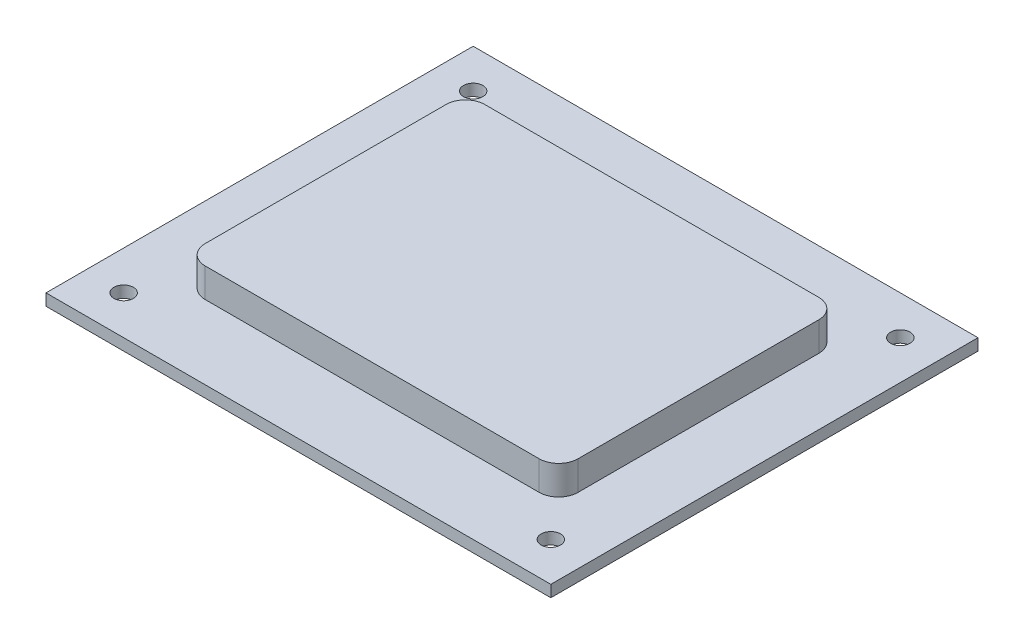
ISO-10303-21;
HEADER;
FILE_DESCRIPTION(('STEP AP214'),'2;1');
FILE_NAME('part.step','',(''),(''),'','','');
FILE_SCHEMA(('AUTOMOTIVE_DESIGN { 1 0 10303 214 1 1 1 1 }'));
ENDSEC;
DATA;
#1=APPLICATION_CONTEXT('core data for automotive mechanical design processes');
#2=APPLICATION_PROTOCOL_DEFINITION('international standard','automotive_design',2000,#1);
#3=PRODUCT_CONTEXT('',#1,'mechanical');
#4=PRODUCT('Part','Part','',(#3));
#5=PRODUCT_RELATED_PRODUCT_CATEGORY('part','',(#4));
#6=PRODUCT_DEFINITION_FORMATION('','',#4);
#7=PRODUCT_DEFINITION_CONTEXT('part definition',#1,'design');
#8=PRODUCT_DEFINITION('design','',#6,#7);
#9=PRODUCT_DEFINITION_SHAPE('','',#8);
#10=(LENGTH_UNIT() NAMED_UNIT(*) SI_UNIT(.MILLI.,.METRE.));
#11=(NAMED_UNIT(*) PLANE_ANGLE_UNIT() SI_UNIT($,.RADIAN.));
#12=(NAMED_UNIT(*) SI_UNIT($,.STERADIAN.) SOLID_ANGLE_UNIT());
#13=UNCERTAINTY_MEASURE_WITH_UNIT(LENGTH_MEASURE(1.E-05),#10,'distance_accuracy_value','');
#14=(GEOMETRIC_REPRESENTATION_CONTEXT(3) GLOBAL_UNCERTAINTY_ASSIGNED_CONTEXT((#13)) GLOBAL_UNIT_ASSIGNED_CONTEXT((#10,
#11,#12)) REPRESENTATION_CONTEXT('',''));
#15=CARTESIAN_POINT('',(0.,0.,0.));
#16=DIRECTION('',(0.,0.,1.));
#17=DIRECTION('',(1.,0.,0.));
#18=AXIS2_PLACEMENT_3D('',#15,#16,#17);
#19=CARTESIAN_POINT('',(8.32688679245284,4.7625,-18.6066981132075));
#20=DIRECTION('',(0.,-1.,0.));
#21=DIRECTION('',(0.,0.,-1.));
#22=AXIS2_PLACEMENT_3D('',#19,#20,#21);
#23=CYLINDRICAL_SURFACE('',#22,3.175);
#24=CARTESIAN_POINT('',(8.32688679245284,0.,-18.6066981132075));
#25=DIRECTION('',(0.,1.,0.));
#26=DIRECTION('',(0.,0.,-1.));
#27=AXIS2_PLACEMENT_3D('',#24,#25,#26);
#28=CIRCLE('',#27,3.175);
#29=CARTESIAN_POINT('',(11.5018867924528,0.,-18.6066981132075));
#30=VERTEX_POINT('',#29);
#31=CARTESIAN_POINT('',(8.32688679245284,0.,-21.7816981132075));
#32=VERTEX_POINT('',#31);
#33=EDGE_CURVE('E155',#30,#32,#28,.T.);
#34=ORIENTED_EDGE('',*,*,#33,.T.);
#35=DIRECTION('',(0.,-1.,0.));
#36=VECTOR('',#35,1.);
#37=CARTESIAN_POINT('',(8.32688679245284,4.7625,-21.7816981132075));
#38=LINE('',#37,#36);
#39=CARTESIAN_POINT('',(8.32688679245284,4.7625,-21.7816981132075));
#40=VERTEX_POINT('',#39);
#41=EDGE_CURVE('E11',#40,#32,#38,.T.);
#42=ORIENTED_EDGE('',*,*,#41,.F.);
#43=CARTESIAN_POINT('',(8.32688679245284,4.7625,-18.6066981132075));
#44=DIRECTION('',(0.,1.,0.));
#45=DIRECTION('',(0.,0.,-1.));
#46=AXIS2_PLACEMENT_3D('',#43,#44,#45);
#47=CIRCLE('',#46,3.175);
#48=CARTESIAN_POINT('',(11.5018867924528,4.7625,-18.6066981132075));
#49=VERTEX_POINT('',#48);
#50=EDGE_CURVE('E166',#49,#40,#47,.T.);
#51=ORIENTED_EDGE('',*,*,#50,.F.);
#52=DIRECTION('',(0.,-1.,0.));
#53=VECTOR('',#52,1.);
#54=CARTESIAN_POINT('',(11.5018867924528,4.7625,-18.6066981132075));
#55=LINE('',#54,#53);
#56=EDGE_CURVE('E189',#49,#30,#55,.T.);
#57=ORIENTED_EDGE('',*,*,#56,.T.);
#58=EDGE_LOOP('',(#34,#42,#51,#57));
#59=FACE_BOUND('',#58,.T.);
#60=ADVANCED_FACE('F42',(#59),#23,.T.);
#61=CARTESIAN_POINT('',(-46.2831132075471,4.7625,-21.7816981132075));
#62=DIRECTION('',(0.,0.,1.));
#63=DIRECTION('',(1.,0.,0.));
#64=AXIS2_PLACEMENT_3D('',#61,#62,#63);
#65=PLANE('',#64);
#66=DIRECTION('',(-1.,0.,0.));
#67=VECTOR('',#66,1.);
#68=CARTESIAN_POINT('',(-46.2831132075471,0.,-21.7816981132075));
#69=LINE('',#68,#67);
#70=CARTESIAN_POINT('',(-46.2831132075471,0.,-21.7816981132075));
#71=VERTEX_POINT('',#70);
#72=EDGE_CURVE('E160',#32,#71,#69,.T.);
#73=ORIENTED_EDGE('',*,*,#72,.T.);
#74=DIRECTION('',(0.,-1.,0.));
#75=VECTOR('',#74,1.);
#76=CARTESIAN_POINT('',(-46.2831132075471,4.7625,-21.7816981132075));
#77=LINE('',#76,#75);
#78=CARTESIAN_POINT('',(-46.2831132075471,4.7625,-21.7816981132075));
#79=VERTEX_POINT('',#78);
#80=EDGE_CURVE('E51',#79,#71,#77,.T.);
#81=ORIENTED_EDGE('',*,*,#80,.F.);
#82=DIRECTION('',(-1.,0.,0.));
#83=VECTOR('',#82,1.);
#84=CARTESIAN_POINT('',(-46.2831132075471,4.7625,-21.7816981132075));
#85=LINE('',#84,#83);
#86=EDGE_CURVE('E169',#40,#79,#85,.T.);
#87=ORIENTED_EDGE('',*,*,#86,.F.);
#88=ORIENTED_EDGE('',*,*,#41,.T.);
#89=EDGE_LOOP('',(#73,#81,#87,#88));
#90=FACE_BOUND('',#89,.T.);
#91=ADVANCED_FACE('F248',(#90),#65,.F.);
#92=CARTESIAN_POINT('',(-46.2831132075472,4.7625,-18.6066981132075));
#93=DIRECTION('',(0.,-1.,0.));
#94=DIRECTION('',(0.,0.,-1.));
#95=AXIS2_PLACEMENT_3D('',#92,#93,#94);
#96=CYLINDRICAL_SURFACE('',#95,3.175);
#97=CARTESIAN_POINT('',(-46.2831132075472,0.,-18.6066981132075));
#98=DIRECTION('',(0.,1.,0.));
#99=DIRECTION('',(0.,0.,1.));
#100=AXIS2_PLACEMENT_3D('',#97,#98,#99);
#101=CIRCLE('',#100,3.175);
#102=CARTESIAN_POINT('',(-49.4581132075472,0.,-18.6066981132075));
#103=VERTEX_POINT('',#102);
#104=EDGE_CURVE('E194',#71,#103,#101,.T.);
#105=ORIENTED_EDGE('',*,*,#104,.T.);
#106=DIRECTION('',(0.,-1.,0.));
#107=VECTOR('',#106,1.);
#108=CARTESIAN_POINT('',(-49.4581132075472,4.7625,-18.6066981132075));
#109=LINE('',#108,#107);
#110=CARTESIAN_POINT('',(-49.4581132075472,4.7625,-18.6066981132075));
#111=VERTEX_POINT('',#110);
#112=EDGE_CURVE('E236',#111,#103,#109,.T.);
#113=ORIENTED_EDGE('',*,*,#112,.F.);
#114=CARTESIAN_POINT('',(-46.2831132075472,4.7625,-18.6066981132075));
#115=DIRECTION('',(0.,1.,0.));
#116=DIRECTION('',(0.,0.,1.));
#117=AXIS2_PLACEMENT_3D('',#114,#115,#116);
#118=CIRCLE('',#117,3.175);
#119=EDGE_CURVE('E173',#79,#111,#118,.T.);
#120=ORIENTED_EDGE('',*,*,#119,.F.);
#121=ORIENTED_EDGE('',*,*,#80,.T.);
#122=EDGE_LOOP('',(#105,#113,#120,#121));
#123=FACE_BOUND('',#122,.T.);
#124=ADVANCED_FACE('F244',(#123),#96,.T.);
#125=CARTESIAN_POINT('',(-49.4581132075472,4.7625,-18.6066981132075));
#126=DIRECTION('',(1.,0.,0.));
#127=DIRECTION('',(0.,0.,-1.));
#128=AXIS2_PLACEMENT_3D('',#125,#126,#127);
#129=PLANE('',#128);
#130=DIRECTION('',(0.,0.,1.));
#131=VECTOR('',#130,1.);
#132=CARTESIAN_POINT('',(-49.4581132075472,0.,-18.6066981132075));
#133=LINE('',#132,#131);
#134=CARTESIAN_POINT('',(-49.4581132075472,0.,20.7633018867924));
#135=VERTEX_POINT('',#134);
#136=EDGE_CURVE('E198',#103,#135,#133,.T.);
#137=ORIENTED_EDGE('',*,*,#136,.T.);
#138=DIRECTION('',(0.,-1.,0.));
#139=VECTOR('',#138,1.);
#140=CARTESIAN_POINT('',(-49.4581132075472,4.7625,20.7633018867924));
#141=LINE('',#140,#139);
#142=CARTESIAN_POINT('',(-49.4581132075472,4.7625,20.7633018867924));
#143=VERTEX_POINT('',#142);
#144=EDGE_CURVE('E232',#143,#135,#141,.T.);
#145=ORIENTED_EDGE('',*,*,#144,.F.);
#146=DIRECTION('',(0.,0.,1.));
#147=VECTOR('',#146,1.);
#148=CARTESIAN_POINT('',(-49.4581132075472,4.7625,-18.6066981132075));
#149=LINE('',#148,#147);
#150=EDGE_CURVE('E176',#111,#143,#149,.T.);
#151=ORIENTED_EDGE('',*,*,#150,.F.);
#152=ORIENTED_EDGE('',*,*,#112,.T.);
#153=EDGE_LOOP('',(#137,#145,#151,#152));
#154=FACE_BOUND('',#153,.T.);
#155=ADVANCED_FACE('F255',(#154),#129,.F.);
#156=CARTESIAN_POINT('',(-46.2831132075472,4.7625,20.7633018867925));
#157=DIRECTION('',(0.,-1.,0.));
#158=DIRECTION('',(0.,0.,-1.));
#159=AXIS2_PLACEMENT_3D('',#156,#157,#158);
#160=CYLINDRICAL_SURFACE('',#159,3.175);
#161=CARTESIAN_POINT('',(-46.2831132075472,0.,20.7633018867925));
#162=DIRECTION('',(0.,1.,0.));
#163=DIRECTION('',(0.,0.,1.));
#164=AXIS2_PLACEMENT_3D('',#161,#162,#163);
#165=CIRCLE('',#164,3.175);
#166=CARTESIAN_POINT('',(-46.2831132075472,0.,23.9383018867925));
#167=VERTEX_POINT('',#166);
#168=EDGE_CURVE('E202',#135,#167,#165,.T.);
#169=ORIENTED_EDGE('',*,*,#168,.T.);
#170=DIRECTION('',(0.,-1.,0.));
#171=VECTOR('',#170,1.);
#172=CARTESIAN_POINT('',(-46.2831132075472,4.7625,23.9383018867925));
#173=LINE('',#172,#171);
#174=CARTESIAN_POINT('',(-46.2831132075472,4.7625,23.9383018867925));
#175=VERTEX_POINT('',#174);
#176=EDGE_CURVE('E228',#175,#167,#173,.T.);
#177=ORIENTED_EDGE('',*,*,#176,.F.);
#178=CARTESIAN_POINT('',(-46.2831132075472,4.7625,20.7633018867925));
#179=DIRECTION('',(0.,1.,0.));
#180=DIRECTION('',(0.,0.,1.));
#181=AXIS2_PLACEMENT_3D('',#178,#179,#180);
#182=CIRCLE('',#181,3.175);
#183=EDGE_CURVE('E179',#143,#175,#182,.T.);
#184=ORIENTED_EDGE('',*,*,#183,.F.);
#185=ORIENTED_EDGE('',*,*,#144,.T.);
#186=EDGE_LOOP('',(#169,#177,#184,#185));
#187=FACE_BOUND('',#186,.T.);
#188=ADVANCED_FACE('F259',(#187),#160,.T.);
#189=CARTESIAN_POINT('',(-46.2831132075471,4.7625,23.9383018867925));
#190=DIRECTION('',(0.,0.,-1.));
#191=DIRECTION('',(-1.,0.,0.));
#192=AXIS2_PLACEMENT_3D('',#189,#190,#191);
#193=PLANE('',#192);
#194=DIRECTION('',(1.,0.,0.));
#195=VECTOR('',#194,1.);
#196=CARTESIAN_POINT('',(-46.2831132075471,0.,23.9383018867925));
#197=LINE('',#196,#195);
#198=CARTESIAN_POINT('',(8.32688679245284,0.,23.9383018867925));
#199=VERTEX_POINT('',#198);
#200=EDGE_CURVE('E206',#167,#199,#197,.T.);
#201=ORIENTED_EDGE('',*,*,#200,.T.);
#202=DIRECTION('',(0.,-1.,0.));
#203=VECTOR('',#202,1.);
#204=CARTESIAN_POINT('',(8.32688679245284,4.7625,23.9383018867925));
#205=LINE('',#204,#203);
#206=CARTESIAN_POINT('',(8.32688679245284,4.7625,23.9383018867925));
#207=VERTEX_POINT('',#206);
#208=EDGE_CURVE('E224',#207,#199,#205,.T.);
#209=ORIENTED_EDGE('',*,*,#208,.F.);
#210=DIRECTION('',(1.,0.,0.));
#211=VECTOR('',#210,1.);
#212=CARTESIAN_POINT('',(-46.2831132075471,4.7625,23.9383018867925));
#213=LINE('',#212,#211);
#214=EDGE_CURVE('E182',#175,#207,#213,.T.);
#215=ORIENTED_EDGE('',*,*,#214,.F.);
#216=ORIENTED_EDGE('',*,*,#176,.T.);
#217=EDGE_LOOP('',(#201,#209,#215,#216));
#218=FACE_BOUND('',#217,.T.);
#219=ADVANCED_FACE('F273',(#218),#193,.F.);
#220=CARTESIAN_POINT('',(8.32688679245284,4.7625,20.7633018867925));
#221=DIRECTION('',(0.,-1.,0.));
#222=DIRECTION('',(0.,0.,-1.));
#223=AXIS2_PLACEMENT_3D('',#220,#221,#222);
#224=CYLINDRICAL_SURFACE('',#223,3.175);
#225=CARTESIAN_POINT('',(8.32688679245284,0.,20.7633018867925));
#226=DIRECTION('',(0.,1.,0.));
#227=DIRECTION('',(0.,0.,-1.));
#228=AXIS2_PLACEMENT_3D('',#225,#226,#227);
#229=CIRCLE('',#228,3.175);
#230=CARTESIAN_POINT('',(11.5018867924528,0.,20.7633018867925));
#231=VERTEX_POINT('',#230);
#232=EDGE_CURVE('E210',#199,#231,#229,.T.);
#233=ORIENTED_EDGE('',*,*,#232,.T.);
#234=DIRECTION('',(0.,-1.,0.));
#235=VECTOR('',#234,1.);
#236=CARTESIAN_POINT('',(11.5018867924528,4.7625,20.7633018867925));
#237=LINE('',#236,#235);
#238=CARTESIAN_POINT('',(11.5018867924528,4.7625,20.7633018867925));
#239=VERTEX_POINT('',#238);
#240=EDGE_CURVE('E220',#239,#231,#237,.T.);
#241=ORIENTED_EDGE('',*,*,#240,.F.);
#242=CARTESIAN_POINT('',(8.32688679245284,4.7625,20.7633018867925));
#243=DIRECTION('',(0.,1.,0.));
#244=DIRECTION('',(0.,0.,-1.));
#245=AXIS2_PLACEMENT_3D('',#242,#243,#244);
#246=CIRCLE('',#245,3.175);
#247=EDGE_CURVE('E185',#207,#239,#246,.T.);
#248=ORIENTED_EDGE('',*,*,#247,.F.);
#249=ORIENTED_EDGE('',*,*,#208,.T.);
#250=EDGE_LOOP('',(#233,#241,#248,#249));
#251=FACE_BOUND('',#250,.T.);
#252=ADVANCED_FACE('F270',(#251),#224,.T.);
#253=CARTESIAN_POINT('',(11.5018867924528,4.7625,-18.6066981132075));
#254=DIRECTION('',(-1.,0.,0.));
#255=DIRECTION('',(0.,0.,1.));
#256=AXIS2_PLACEMENT_3D('',#253,#254,#255);
#257=PLANE('',#256);
#258=DIRECTION('',(0.,0.,-1.));
#259=VECTOR('',#258,1.);
#260=CARTESIAN_POINT('',(11.5018867924528,0.,-18.6066981132075));
#261=LINE('',#260,#259);
#262=EDGE_CURVE('E170',#231,#30,#261,.T.);
#263=ORIENTED_EDGE('',*,*,#262,.T.);
#264=ORIENTED_EDGE('',*,*,#56,.F.);
#265=DIRECTION('',(0.,0.,-1.));
#266=VECTOR('',#265,1.);
#267=CARTESIAN_POINT('',(11.5018867924528,4.7625,-18.6066981132075));
#268=LINE('',#267,#266);
#269=EDGE_CURVE('E58',#239,#49,#268,.T.);
#270=ORIENTED_EDGE('',*,*,#269,.F.);
#271=ORIENTED_EDGE('',*,*,#240,.T.);
#272=EDGE_LOOP('',(#263,#264,#270,#271));
#273=FACE_BOUND('',#272,.T.);
#274=ADVANCED_FACE('F267',(#273),#257,.F.);
#275=CARTESIAN_POINT('',(8.32688679245284,4.7625,-18.6066981132075));
#276=DIRECTION('',(0.,-1.,0.));
#277=DIRECTION('',(0.,0.,-1.));
#278=AXIS2_PLACEMENT_3D('',#275,#276,#277);
#279=PLANE('',#278);
#280=ORIENTED_EDGE('',*,*,#50,.T.);
#281=ORIENTED_EDGE('',*,*,#86,.T.);
#282=ORIENTED_EDGE('',*,*,#119,.T.);
#283=ORIENTED_EDGE('',*,*,#150,.T.);
#284=ORIENTED_EDGE('',*,*,#183,.T.);
#285=ORIENTED_EDGE('',*,*,#214,.T.);
#286=ORIENTED_EDGE('',*,*,#247,.T.);
#287=ORIENTED_EDGE('',*,*,#269,.T.);
#288=EDGE_LOOP('',(#280,#281,#282,#283,#284,#285,#286,#287));
#289=FACE_BOUND('',#288,.T.);
#290=ADVANCED_FACE('F262',(#289),#279,.F.);
#291=CARTESIAN_POINT('',(-60.2531132075472,-1.905,36.0033018867925));
#292=DIRECTION('',(1.,0.,0.));
#293=DIRECTION('',(0.,0.,-1.));
#294=AXIS2_PLACEMENT_3D('',#291,#292,#293);
#295=PLANE('',#294);
#296=DIRECTION('',(0.,0.,-1.));
#297=VECTOR('',#296,1.);
#298=CARTESIAN_POINT('',(-60.2531132075472,0.,36.0033018867925));
#299=LINE('',#298,#297);
#300=CARTESIAN_POINT('',(-60.2531132075472,0.,36.0033018867925));
#301=VERTEX_POINT('',#300);
#302=CARTESIAN_POINT('',(-60.2531132075471,0.,-33.8466981132075));
#303=VERTEX_POINT('',#302);
#304=EDGE_CURVE('E153',#301,#303,#299,.T.);
#305=ORIENTED_EDGE('',*,*,#304,.T.);
#306=DIRECTION('',(0.,1.,0.));
#307=VECTOR('',#306,1.);
#308=CARTESIAN_POINT('',(-60.2531132075471,-1.905,-33.8466981132075));
#309=LINE('',#308,#307);
#310=CARTESIAN_POINT('',(-60.2531132075471,-1.905,-33.8466981132075));
#311=VERTEX_POINT('',#310);
#312=EDGE_CURVE('E131',#311,#303,#309,.T.);
#313=ORIENTED_EDGE('',*,*,#312,.F.);
#314=DIRECTION('',(0.,0.,-1.));
#315=VECTOR('',#314,1.);
#316=CARTESIAN_POINT('',(-60.2531132075472,-1.905,36.0033018867925));
#317=LINE('',#316,#315);
#318=CARTESIAN_POINT('',(-60.2531132075472,-1.905,36.0033018867925));
#319=VERTEX_POINT('',#318);
#320=EDGE_CURVE('E139',#319,#311,#317,.T.);
#321=ORIENTED_EDGE('',*,*,#320,.F.);
#322=DIRECTION('',(0.,1.,0.));
#323=VECTOR('',#322,1.);
#324=CARTESIAN_POINT('',(-60.2531132075472,-1.905,36.0033018867925));
#325=LINE('',#324,#323);
#326=EDGE_CURVE('E507',#319,#301,#325,.T.);
#327=ORIENTED_EDGE('',*,*,#326,.T.);
#328=EDGE_LOOP('',(#305,#313,#321,#327));
#329=FACE_BOUND('',#328,.T.);
#330=ADVANCED_FACE('F151',(#329),#295,.F.);
#331=CARTESIAN_POINT('',(-60.2531132075471,-1.905,-33.8466981132075));
#332=DIRECTION('',(0.,0.,1.));
#333=DIRECTION('',(1.,0.,0.));
#334=AXIS2_PLACEMENT_3D('',#331,#332,#333);
#335=PLANE('',#334);
#336=DIRECTION('',(1.,0.,0.));
#337=VECTOR('',#336,1.);
#338=CARTESIAN_POINT('',(-60.2531132075471,0.,-33.8466981132075));
#339=LINE('',#338,#337);
#340=CARTESIAN_POINT('',(22.2968867924529,0.,-33.8466981132075));
#341=VERTEX_POINT('',#340);
#342=EDGE_CURVE('E510',#303,#341,#339,.T.);
#343=ORIENTED_EDGE('',*,*,#342,.T.);
#344=DIRECTION('',(0.,1.,0.));
#345=VECTOR('',#344,1.);
#346=CARTESIAN_POINT('',(22.2968867924529,-1.905,-33.8466981132075));
#347=LINE('',#346,#345);
#348=CARTESIAN_POINT('',(22.2968867924529,-1.905,-33.8466981132075));
#349=VERTEX_POINT('',#348);
#350=EDGE_CURVE('E134',#349,#341,#347,.T.);
#351=ORIENTED_EDGE('',*,*,#350,.F.);
#352=DIRECTION('',(1.,0.,0.));
#353=VECTOR('',#352,1.);
#354=CARTESIAN_POINT('',(-60.2531132075471,-1.905,-33.8466981132075));
#355=LINE('',#354,#353);
#356=EDGE_CURVE('E127',#311,#349,#355,.T.);
#357=ORIENTED_EDGE('',*,*,#356,.F.);
#358=ORIENTED_EDGE('',*,*,#312,.T.);
#359=EDGE_LOOP('',(#343,#351,#357,#358));
#360=FACE_BOUND('',#359,.T.);
#361=ADVANCED_FACE('F129',(#360),#335,.F.);
#362=CARTESIAN_POINT('',(22.2968867924529,-1.905,36.0033018867925));
#363=DIRECTION('',(-1.,0.,0.));
#364=DIRECTION('',(0.,0.,1.));
#365=AXIS2_PLACEMENT_3D('',#362,#363,#364);
#366=PLANE('',#365);
#367=DIRECTION('',(0.,0.,1.));
#368=VECTOR('',#367,1.);
#369=CARTESIAN_POINT('',(22.2968867924529,0.,36.0033018867925));
#370=LINE('',#369,#368);
#371=CARTESIAN_POINT('',(22.2968867924529,0.,36.0033018867925));
#372=VERTEX_POINT('',#371);
#373=EDGE_CURVE('E513',#341,#372,#370,.T.);
#374=ORIENTED_EDGE('',*,*,#373,.T.);
#375=DIRECTION('',(0.,1.,0.));
#376=VECTOR('',#375,1.);
#377=CARTESIAN_POINT('',(22.2968867924529,-1.905,36.0033018867925));
#378=LINE('',#377,#376);
#379=CARTESIAN_POINT('',(22.2968867924529,-1.905,36.0033018867925));
#380=VERTEX_POINT('',#379);
#381=EDGE_CURVE('E162',#380,#372,#378,.T.);
#382=ORIENTED_EDGE('',*,*,#381,.F.);
#383=DIRECTION('',(0.,0.,1.));
#384=VECTOR('',#383,1.);
#385=CARTESIAN_POINT('',(22.2968867924529,-1.905,36.0033018867925));
#386=LINE('',#385,#384);
#387=EDGE_CURVE('E138',#349,#380,#386,.T.);
#388=ORIENTED_EDGE('',*,*,#387,.F.);
#389=ORIENTED_EDGE('',*,*,#350,.T.);
#390=EDGE_LOOP('',(#374,#382,#388,#389));
#391=FACE_BOUND('',#390,.T.);
#392=ADVANCED_FACE('F342',(#391),#366,.F.);
#393=CARTESIAN_POINT('',(-60.2531132075472,-1.905,36.0033018867925));
#394=DIRECTION('',(0.,0.,-1.));
#395=DIRECTION('',(-1.,0.,0.));
#396=AXIS2_PLACEMENT_3D('',#393,#394,#395);
#397=PLANE('',#396);
#398=DIRECTION('',(-1.,0.,0.));
#399=VECTOR('',#398,1.);
#400=CARTESIAN_POINT('',(-60.2531132075472,0.,36.0033018867925));
#401=LINE('',#400,#399);
#402=EDGE_CURVE('E149',#372,#301,#401,.T.);
#403=ORIENTED_EDGE('',*,*,#402,.T.);
#404=ORIENTED_EDGE('',*,*,#326,.F.);
#405=DIRECTION('',(-1.,0.,0.));
#406=VECTOR('',#405,1.);
#407=CARTESIAN_POINT('',(-60.2531132075472,-1.905,36.0033018867925));
#408=LINE('',#407,#406);
#409=EDGE_CURVE('E144',#380,#319,#408,.T.);
#410=ORIENTED_EDGE('',*,*,#409,.F.);
#411=ORIENTED_EDGE('',*,*,#381,.T.);
#412=EDGE_LOOP('',(#403,#404,#410,#411));
#413=FACE_BOUND('',#412,.T.);
#414=ADVANCED_FACE('F352',(#413),#397,.F.);
#415=CARTESIAN_POINT('',(0.,-1.905,0.));
#416=DIRECTION('',(0.,-1.,0.));
#417=DIRECTION('',(0.,0.,-1.));
#418=AXIS2_PLACEMENT_3D('',#415,#416,#417);
#419=PLANE('',#418);
#420=CARTESIAN_POINT('',(-53.9031132075472,-1.905,29.6533018867925));
#421=DIRECTION('',(0.,1.,0.));
#422=DIRECTION('',(0.,0.,1.));
#423=AXIS2_PLACEMENT_3D('',#420,#421,#422);
#424=CIRCLE('',#423,1.5875);
#425=CARTESIAN_POINT('',(-53.9031132075472,-1.905,31.2408018867925));
#426=VERTEX_POINT('',#425);
#427=EDGE_CURVE('E479',#426,#426,#424,.T.);
#428=ORIENTED_EDGE('',*,*,#427,.T.);
#429=EDGE_LOOP('',(#428));
#430=FACE_BOUND('',#429,.T.);
#431=CARTESIAN_POINT('',(15.9468867924529,-1.905,29.6533018867925));
#432=DIRECTION('',(0.,1.,0.));
#433=DIRECTION('',(0.,0.,1.));
#434=AXIS2_PLACEMENT_3D('',#431,#432,#433);
#435=CIRCLE('',#434,1.5875);
#436=CARTESIAN_POINT('',(15.9468867924529,-1.905,31.2408018867925));
#437=VERTEX_POINT('',#436);
#438=EDGE_CURVE('E484',#437,#437,#435,.T.);
#439=ORIENTED_EDGE('',*,*,#438,.T.);
#440=EDGE_LOOP('',(#439));
#441=FACE_BOUND('',#440,.T.);
#442=CARTESIAN_POINT('',(15.9468867924528,-1.905,-27.4966981132075));
#443=DIRECTION('',(0.,1.,0.));
#444=DIRECTION('',(0.,0.,1.));
#445=AXIS2_PLACEMENT_3D('',#442,#443,#444);
#446=CIRCLE('',#445,1.5875);
#447=CARTESIAN_POINT('',(15.9468867924528,-1.905,-25.9091981132075));
#448=VERTEX_POINT('',#447);
#449=EDGE_CURVE('E527',#448,#448,#446,.T.);
#450=ORIENTED_EDGE('',*,*,#449,.T.);
#451=EDGE_LOOP('',(#450));
#452=FACE_BOUND('',#451,.T.);
#453=CARTESIAN_POINT('',(-53.9031132075472,-1.905,-27.4966981132075));
#454=DIRECTION('',(0.,1.,0.));
#455=DIRECTION('',(0.,0.,1.));
#456=AXIS2_PLACEMENT_3D('',#453,#454,#455);
#457=CIRCLE('',#456,1.5875);
#458=CARTESIAN_POINT('',(-53.9031132075472,-1.905,-25.9091981132075));
#459=VERTEX_POINT('',#458);
#460=EDGE_CURVE('E494',#459,#459,#457,.T.);
#461=ORIENTED_EDGE('',*,*,#460,.T.);
#462=EDGE_LOOP('',(#461));
#463=FACE_BOUND('',#462,.T.);
#464=ORIENTED_EDGE('',*,*,#320,.T.);
#465=ORIENTED_EDGE('',*,*,#356,.T.);
#466=ORIENTED_EDGE('',*,*,#387,.T.);
#467=ORIENTED_EDGE('',*,*,#409,.T.);
#468=EDGE_LOOP('',(#464,#465,#466,#467));
#469=FACE_BOUND('',#468,.T.);
#470=ADVANCED_FACE('F142',(#430,#441,#452,#463,#469),#419,.T.);
#471=CARTESIAN_POINT('',(0.,0.,0.));
#472=DIRECTION('',(0.,-1.,0.));
#473=DIRECTION('',(0.,0.,-1.));
#474=AXIS2_PLACEMENT_3D('',#471,#472,#473);
#475=PLANE('',#474);
#476=CARTESIAN_POINT('',(-53.9031132075472,0.,29.6533018867925));
#477=DIRECTION('',(0.,1.,0.));
#478=DIRECTION('',(0.,0.,1.));
#479=AXIS2_PLACEMENT_3D('',#476,#477,#478);
#480=CIRCLE('',#479,1.5875);
#481=CARTESIAN_POINT('',(-53.9031132075472,0.,31.2408018867925));
#482=VERTEX_POINT('',#481);
#483=EDGE_CURVE('E482',#482,#482,#480,.T.);
#484=ORIENTED_EDGE('',*,*,#483,.F.);
#485=EDGE_LOOP('',(#484));
#486=FACE_BOUND('',#485,.T.);
#487=CARTESIAN_POINT('',(15.9468867924529,0.,29.6533018867925));
#488=DIRECTION('',(0.,1.,0.));
#489=DIRECTION('',(0.,0.,1.));
#490=AXIS2_PLACEMENT_3D('',#487,#488,#489);
#491=CIRCLE('',#490,1.5875);
#492=CARTESIAN_POINT('',(15.9468867924529,0.,31.2408018867925));
#493=VERTEX_POINT('',#492);
#494=EDGE_CURVE('E489',#493,#493,#491,.T.);
#495=ORIENTED_EDGE('',*,*,#494,.F.);
#496=EDGE_LOOP('',(#495));
#497=FACE_BOUND('',#496,.T.);
#498=CARTESIAN_POINT('',(15.9468867924528,0.,-27.4966981132075));
#499=DIRECTION('',(0.,1.,0.));
#500=DIRECTION('',(0.,0.,1.));
#501=AXIS2_PLACEMENT_3D('',#498,#499,#500);
#502=CIRCLE('',#501,1.5875);
#503=CARTESIAN_POINT('',(15.9468867924528,0.,-25.9091981132075));
#504=VERTEX_POINT('',#503);
#505=EDGE_CURVE('E501',#504,#504,#502,.T.);
#506=ORIENTED_EDGE('',*,*,#505,.F.);
#507=EDGE_LOOP('',(#506));
#508=FACE_BOUND('',#507,.T.);
#509=CARTESIAN_POINT('',(-53.9031132075472,0.,-27.4966981132075));
#510=DIRECTION('',(0.,1.,0.));
#511=DIRECTION('',(0.,0.,1.));
#512=AXIS2_PLACEMENT_3D('',#509,#510,#511);
#513=CIRCLE('',#512,1.5875);
#514=CARTESIAN_POINT('',(-53.9031132075472,0.,-25.9091981132075));
#515=VERTEX_POINT('',#514);
#516=EDGE_CURVE('E498',#515,#515,#513,.T.);
#517=ORIENTED_EDGE('',*,*,#516,.F.);
#518=EDGE_LOOP('',(#517));
#519=FACE_BOUND('',#518,.T.);
#520=ORIENTED_EDGE('',*,*,#33,.F.);
#521=ORIENTED_EDGE('',*,*,#262,.F.);
#522=ORIENTED_EDGE('',*,*,#232,.F.);
#523=ORIENTED_EDGE('',*,*,#200,.F.);
#524=ORIENTED_EDGE('',*,*,#168,.F.);
#525=ORIENTED_EDGE('',*,*,#136,.F.);
#526=ORIENTED_EDGE('',*,*,#104,.F.);
#527=ORIENTED_EDGE('',*,*,#72,.F.);
#528=EDGE_LOOP('',(#520,#521,#522,#523,#524,#525,#526,#527));
#529=FACE_BOUND('',#528,.T.);
#530=ORIENTED_EDGE('',*,*,#304,.F.);
#531=ORIENTED_EDGE('',*,*,#402,.F.);
#532=ORIENTED_EDGE('',*,*,#373,.F.);
#533=ORIENTED_EDGE('',*,*,#342,.F.);
#534=EDGE_LOOP('',(#530,#531,#532,#533));
#535=FACE_BOUND('',#534,.T.);
#536=ADVANCED_FACE('F251',(#486,#497,#508,#519,#529,#535),#475,.F.);
#537=CARTESIAN_POINT('',(-53.9031132075472,-1.905,-27.4966981132075));
#538=DIRECTION('',(0.,1.,0.));
#539=DIRECTION('',(0.,0.,1.));
#540=AXIS2_PLACEMENT_3D('',#537,#538,#539);
#541=CYLINDRICAL_SURFACE('',#540,1.5875);
#542=CARTESIAN_POINT('',(-53.9031132075472,-1.905,-25.9091981132075));
#543=CARTESIAN_POINT('',(-53.9031132075472,-1.88515625,-25.9091981132075));
#544=CARTESIAN_POINT('',(-53.9031132075472,-1.8653125,-25.9091981132075));
#545=CARTESIAN_POINT('',(-53.9031132075472,-1.825625,-25.9091981132075));
#546=CARTESIAN_POINT('',(-53.9031132075472,-1.80578125,-25.9091981132075));
#547=CARTESIAN_POINT('',(-53.9031132075472,-1.76609375,-25.9091981132075));
#548=CARTESIAN_POINT('',(-53.9031132075472,-1.74625,-25.9091981132075));
#549=CARTESIAN_POINT('',(-53.9031132075472,-1.7065625,-25.9091981132075));
#550=CARTESIAN_POINT('',(-53.9031132075472,-1.68671875,-25.9091981132075));
#551=CARTESIAN_POINT('',(-53.9031132075472,-1.64703125,-25.9091981132075));
#552=CARTESIAN_POINT('',(-53.9031132075472,-1.6271875,-25.9091981132075));
#553=CARTESIAN_POINT('',(-53.9031132075472,-1.5875,-25.9091981132075));
#554=CARTESIAN_POINT('',(-53.9031132075472,-1.56765625,-25.9091981132075));
#555=CARTESIAN_POINT('',(-53.9031132075472,-1.52796875,-25.9091981132075));
#556=CARTESIAN_POINT('',(-53.9031132075472,-1.508125,-25.9091981132075));
#557=CARTESIAN_POINT('',(-53.9031132075472,-1.4684375,-25.9091981132075));
#558=CARTESIAN_POINT('',(-53.9031132075472,-1.44859375,-25.9091981132075));
#559=CARTESIAN_POINT('',(-53.9031132075472,-1.40890625,-25.9091981132075));
#560=CARTESIAN_POINT('',(-53.9031132075472,-1.3890625,-25.9091981132075));
#561=CARTESIAN_POINT('',(-53.9031132075472,-1.349375,-25.9091981132075));
#562=CARTESIAN_POINT('',(-53.9031132075472,-1.32953125,-25.9091981132075));
#563=CARTESIAN_POINT('',(-53.9031132075472,-1.28984375,-25.9091981132075));
#564=CARTESIAN_POINT('',(-53.9031132075472,-1.27,-25.9091981132075));
#565=CARTESIAN_POINT('',(-53.9031132075472,-1.2303125,-25.9091981132075));
#566=CARTESIAN_POINT('',(-53.9031132075472,-1.21046875,-25.9091981132075));
#567=CARTESIAN_POINT('',(-53.9031132075472,-1.17078125,-25.9091981132075));
#568=CARTESIAN_POINT('',(-53.9031132075472,-1.1509375,-25.9091981132075));
#569=CARTESIAN_POINT('',(-53.9031132075472,-1.11125,-25.9091981132075));
#570=CARTESIAN_POINT('',(-53.9031132075472,-1.09140625,-25.9091981132075));
#571=CARTESIAN_POINT('',(-53.9031132075472,-1.05171875,-25.9091981132075));
#572=CARTESIAN_POINT('',(-53.9031132075472,-1.031875,-25.9091981132075));
#573=CARTESIAN_POINT('',(-53.9031132075472,-0.9921875,-25.9091981132075));
#574=CARTESIAN_POINT('',(-53.9031132075472,-0.97234375,-25.9091981132075));
#575=CARTESIAN_POINT('',(-53.9031132075472,-0.93265625,-25.9091981132075));
#576=CARTESIAN_POINT('',(-53.9031132075472,-0.9128125,-25.9091981132075));
#577=CARTESIAN_POINT('',(-53.9031132075472,-0.873125,-25.9091981132075));
#578=CARTESIAN_POINT('',(-53.9031132075472,-0.85328125,-25.9091981132075));
#579=CARTESIAN_POINT('',(-53.9031132075472,-0.81359375,-25.9091981132075));
#580=CARTESIAN_POINT('',(-53.9031132075472,-0.79375,-25.9091981132075));
#581=CARTESIAN_POINT('',(-53.9031132075472,-0.7540625,-25.9091981132075));
#582=CARTESIAN_POINT('',(-53.9031132075472,-0.73421875,-25.9091981132075));
#583=CARTESIAN_POINT('',(-53.9031132075472,-0.69453125,-25.9091981132075));
#584=CARTESIAN_POINT('',(-53.9031132075472,-0.6746875,-25.9091981132075));
#585=CARTESIAN_POINT('',(-53.9031132075472,-0.635,-25.9091981132075));
#586=CARTESIAN_POINT('',(-53.9031132075472,-0.61515625,-25.9091981132075));
#587=CARTESIAN_POINT('',(-53.9031132075472,-0.57546875,-25.9091981132075));
#588=CARTESIAN_POINT('',(-53.9031132075472,-0.555625,-25.9091981132075));
#589=CARTESIAN_POINT('',(-53.9031132075472,-0.5159375,-25.9091981132075));
#590=CARTESIAN_POINT('',(-53.9031132075472,-0.49609375,-25.9091981132075));
#591=CARTESIAN_POINT('',(-53.9031132075472,-0.45640625,-25.9091981132075));
#592=CARTESIAN_POINT('',(-53.9031132075472,-0.4365625,-25.9091981132075));
#593=CARTESIAN_POINT('',(-53.9031132075472,-0.396875,-25.9091981132075));
#594=CARTESIAN_POINT('',(-53.9031132075472,-0.37703125,-25.9091981132075));
#595=CARTESIAN_POINT('',(-53.9031132075472,-0.33734375,-25.9091981132075));
#596=CARTESIAN_POINT('',(-53.9031132075472,-0.3175,-25.9091981132075));
#597=CARTESIAN_POINT('',(-53.9031132075472,-0.2778125,-25.9091981132075));
#598=CARTESIAN_POINT('',(-53.9031132075472,-0.25796875,-25.9091981132075));
#599=CARTESIAN_POINT('',(-53.9031132075472,-0.21828125,-25.9091981132075));
#600=CARTESIAN_POINT('',(-53.9031132075472,-0.1984375,-25.9091981132075));
#601=CARTESIAN_POINT('',(-53.9031132075472,-0.15875,-25.9091981132075));
#602=CARTESIAN_POINT('',(-53.9031132075472,-0.13890625,-25.9091981132075));
#603=CARTESIAN_POINT('',(-53.9031132075472,-0.09921875,-25.9091981132075));
#604=CARTESIAN_POINT('',(-53.9031132075472,-0.0793749999999999,-25.9091981132075));
#605=CARTESIAN_POINT('',(-53.9031132075472,-0.0396874999999999,-25.9091981132075));
#606=CARTESIAN_POINT('',(-53.9031132075472,-0.01984375,-25.9091981132075));
#607=CARTESIAN_POINT('',(-53.9031132075472,0.,-25.9091981132075));
#608=B_SPLINE_CURVE_WITH_KNOTS('',3,(#542,#543,#544,#545,#546,#547,#548,#549,#550,#551,#552,
#553,#554,#555,#556,#557,#558,#559,#560,#561,#562,#563,#564,#565,#566,#567,#568,#569,#570,#571,
#572,#573,#574,#575,#576,#577,#578,#579,#580,#581,#582,#583,#584,#585,#586,#587,#588,#589,#590,
#591,#592,#593,#594,#595,#596,#597,#598,#599,#600,#601,#602,#603,#604,#605,#606,#607),
.UNSPECIFIED.,.F.,.F.,(4,2,2,2,2,2,2,2,2,2,2,2,2,2,2,2,2,2,2,2,2,2,2,2,2,2,2,2,2,2,2,2,4),(0.,
0.0595312499999999,0.1190625,0.17859375,0.238125,0.29765625,0.3571875,0.41671875,0.47625,
0.53578125,0.5953125,0.65484375,0.714375,0.77390625,0.8334375,0.89296875,0.9525,1.01203125,
1.0715625,1.13109375,1.190625,1.25015625,1.3096875,1.36921875,1.42875,1.48828125,1.5478125,
1.60734375,1.666875,1.72640625,1.7859375,1.84546875,1.905),.UNSPECIFIED.);
#609=EDGE_CURVE('BSEAM383',#459,#515,#608,.T.);
#610=ORIENTED_EDGE('',*,*,#460,.F.);
#611=ORIENTED_EDGE('',*,*,#516,.T.);
#612=ORIENTED_EDGE('',*,*,#609,.T.);
#613=ORIENTED_EDGE('',*,*,#609,.F.);
#614=EDGE_LOOP('',(#610,#612,#611,#613));
#615=FACE_BOUND('',#614,.T.);
#616=ADVANCED_FACE('F383',(#615),#541,.F.);
#617=CARTESIAN_POINT('',(15.9468867924528,-1.905,-27.4966981132075));
#618=DIRECTION('',(0.,1.,0.));
#619=DIRECTION('',(0.,0.,1.));
#620=AXIS2_PLACEMENT_3D('',#617,#618,#619);
#621=CYLINDRICAL_SURFACE('',#620,1.5875);
#622=CARTESIAN_POINT('',(15.9468867924528,-1.905,-25.9091981132075));
#623=CARTESIAN_POINT('',(15.9468867924528,-1.88515625,-25.9091981132075));
#624=CARTESIAN_POINT('',(15.9468867924528,-1.8653125,-25.9091981132075));
#625=CARTESIAN_POINT('',(15.9468867924528,-1.825625,-25.9091981132075));
#626=CARTESIAN_POINT('',(15.9468867924528,-1.80578125,-25.9091981132075));
#627=CARTESIAN_POINT('',(15.9468867924528,-1.76609375,-25.9091981132075));
#628=CARTESIAN_POINT('',(15.9468867924528,-1.74625,-25.9091981132075));
#629=CARTESIAN_POINT('',(15.9468867924528,-1.7065625,-25.9091981132075));
#630=CARTESIAN_POINT('',(15.9468867924528,-1.68671875,-25.9091981132075));
#631=CARTESIAN_POINT('',(15.9468867924528,-1.64703125,-25.9091981132075));
#632=CARTESIAN_POINT('',(15.9468867924528,-1.6271875,-25.9091981132075));
#633=CARTESIAN_POINT('',(15.9468867924528,-1.5875,-25.9091981132075));
#634=CARTESIAN_POINT('',(15.9468867924528,-1.56765625,-25.9091981132075));
#635=CARTESIAN_POINT('',(15.9468867924528,-1.52796875,-25.9091981132075));
#636=CARTESIAN_POINT('',(15.9468867924528,-1.508125,-25.9091981132075));
#637=CARTESIAN_POINT('',(15.9468867924528,-1.4684375,-25.9091981132075));
#638=CARTESIAN_POINT('',(15.9468867924528,-1.44859375,-25.9091981132075));
#639=CARTESIAN_POINT('',(15.9468867924528,-1.40890625,-25.9091981132075));
#640=CARTESIAN_POINT('',(15.9468867924528,-1.3890625,-25.9091981132075));
#641=CARTESIAN_POINT('',(15.9468867924528,-1.349375,-25.9091981132075));
#642=CARTESIAN_POINT('',(15.9468867924528,-1.32953125,-25.9091981132075));
#643=CARTESIAN_POINT('',(15.9468867924528,-1.28984375,-25.9091981132075));
#644=CARTESIAN_POINT('',(15.9468867924528,-1.27,-25.9091981132075));
#645=CARTESIAN_POINT('',(15.9468867924528,-1.2303125,-25.9091981132075));
#646=CARTESIAN_POINT('',(15.9468867924528,-1.21046875,-25.9091981132075));
#647=CARTESIAN_POINT('',(15.9468867924528,-1.17078125,-25.9091981132075));
#648=CARTESIAN_POINT('',(15.9468867924528,-1.1509375,-25.9091981132075));
#649=CARTESIAN_POINT('',(15.9468867924528,-1.11125,-25.9091981132075));
#650=CARTESIAN_POINT('',(15.9468867924528,-1.09140625,-25.9091981132075));
#651=CARTESIAN_POINT('',(15.9468867924528,-1.05171875,-25.9091981132075));
#652=CARTESIAN_POINT('',(15.9468867924528,-1.031875,-25.9091981132075));
#653=CARTESIAN_POINT('',(15.9468867924528,-0.9921875,-25.9091981132075));
#654=CARTESIAN_POINT('',(15.9468867924528,-0.97234375,-25.9091981132075));
#655=CARTESIAN_POINT('',(15.9468867924528,-0.93265625,-25.9091981132075));
#656=CARTESIAN_POINT('',(15.9468867924528,-0.9128125,-25.9091981132075));
#657=CARTESIAN_POINT('',(15.9468867924528,-0.873125,-25.9091981132075));
#658=CARTESIAN_POINT('',(15.9468867924528,-0.85328125,-25.9091981132075));
#659=CARTESIAN_POINT('',(15.9468867924528,-0.81359375,-25.9091981132075));
#660=CARTESIAN_POINT('',(15.9468867924528,-0.79375,-25.9091981132075));
#661=CARTESIAN_POINT('',(15.9468867924528,-0.7540625,-25.9091981132075));
#662=CARTESIAN_POINT('',(15.9468867924528,-0.73421875,-25.9091981132075));
#663=CARTESIAN_POINT('',(15.9468867924528,-0.69453125,-25.9091981132075));
#664=CARTESIAN_POINT('',(15.9468867924528,-0.6746875,-25.9091981132075));
#665=CARTESIAN_POINT('',(15.9468867924528,-0.635,-25.9091981132075));
#666=CARTESIAN_POINT('',(15.9468867924528,-0.61515625,-25.9091981132075));
#667=CARTESIAN_POINT('',(15.9468867924528,-0.57546875,-25.9091981132075));
#668=CARTESIAN_POINT('',(15.9468867924528,-0.555625,-25.9091981132075));
#669=CARTESIAN_POINT('',(15.9468867924528,-0.5159375,-25.9091981132075));
#670=CARTESIAN_POINT('',(15.9468867924528,-0.49609375,-25.9091981132075));
#671=CARTESIAN_POINT('',(15.9468867924528,-0.45640625,-25.9091981132075));
#672=CARTESIAN_POINT('',(15.9468867924528,-0.4365625,-25.9091981132075));
#673=CARTESIAN_POINT('',(15.9468867924528,-0.396875,-25.9091981132075));
#674=CARTESIAN_POINT('',(15.9468867924528,-0.37703125,-25.9091981132075));
#675=CARTESIAN_POINT('',(15.9468867924528,-0.33734375,-25.9091981132075));
#676=CARTESIAN_POINT('',(15.9468867924528,-0.3175,-25.9091981132075));
#677=CARTESIAN_POINT('',(15.9468867924528,-0.2778125,-25.9091981132075));
#678=CARTESIAN_POINT('',(15.9468867924528,-0.25796875,-25.9091981132075));
#679=CARTESIAN_POINT('',(15.9468867924528,-0.21828125,-25.9091981132075));
#680=CARTESIAN_POINT('',(15.9468867924528,-0.1984375,-25.9091981132075));
#681=CARTESIAN_POINT('',(15.9468867924528,-0.15875,-25.9091981132075));
#682=CARTESIAN_POINT('',(15.9468867924528,-0.13890625,-25.9091981132075));
#683=CARTESIAN_POINT('',(15.9468867924528,-0.09921875,-25.9091981132075));
#684=CARTESIAN_POINT('',(15.9468867924528,-0.0793749999999999,-25.9091981132075));
#685=CARTESIAN_POINT('',(15.9468867924528,-0.0396874999999999,-25.9091981132075));
#686=CARTESIAN_POINT('',(15.9468867924528,-0.01984375,-25.9091981132075));
#687=CARTESIAN_POINT('',(15.9468867924528,0.,-25.9091981132075));
#688=B_SPLINE_CURVE_WITH_KNOTS('',3,(#622,#623,#624,#625,#626,#627,#628,#629,#630,#631,#632,
#633,#634,#635,#636,#637,#638,#639,#640,#641,#642,#643,#644,#645,#646,#647,#648,#649,#650,#651,
#652,#653,#654,#655,#656,#657,#658,#659,#660,#661,#662,#663,#664,#665,#666,#667,#668,#669,#670,
#671,#672,#673,#674,#675,#676,#677,#678,#679,#680,#681,#682,#683,#684,#685,#686,#687),
.UNSPECIFIED.,.F.,.F.,(4,2,2,2,2,2,2,2,2,2,2,2,2,2,2,2,2,2,2,2,2,2,2,2,2,2,2,2,2,2,2,2,4),(0.,
0.0595312499999999,0.1190625,0.17859375,0.238125,0.29765625,0.3571875,0.41671875,0.47625,
0.53578125,0.5953125,0.65484375,0.714375,0.77390625,0.8334375,0.89296875,0.9525,1.01203125,
1.0715625,1.13109375,1.190625,1.25015625,1.3096875,1.36921875,1.42875,1.48828125,1.5478125,
1.60734375,1.666875,1.72640625,1.7859375,1.84546875,1.905),.UNSPECIFIED.);
#689=EDGE_CURVE('BSEAM394',#448,#504,#688,.T.);
#690=ORIENTED_EDGE('',*,*,#449,.F.);
#691=ORIENTED_EDGE('',*,*,#505,.T.);
#692=ORIENTED_EDGE('',*,*,#689,.T.);
#693=ORIENTED_EDGE('',*,*,#689,.F.);
#694=EDGE_LOOP('',(#690,#692,#691,#693));
#695=FACE_BOUND('',#694,.T.);
#696=ADVANCED_FACE('F394',(#695),#621,.F.);
#697=CARTESIAN_POINT('',(15.9468867924529,-1.905,29.6533018867925));
#698=DIRECTION('',(0.,1.,0.));
#699=DIRECTION('',(0.,0.,1.));
#700=AXIS2_PLACEMENT_3D('',#697,#698,#699);
#701=CYLINDRICAL_SURFACE('',#700,1.5875);
#702=CARTESIAN_POINT('',(15.9468867924529,-1.905,31.2408018867925));
#703=CARTESIAN_POINT('',(15.9468867924529,-1.88515625,31.2408018867925));
#704=CARTESIAN_POINT('',(15.9468867924529,-1.8653125,31.2408018867925));
#705=CARTESIAN_POINT('',(15.9468867924529,-1.825625,31.2408018867925));
#706=CARTESIAN_POINT('',(15.9468867924529,-1.80578125,31.2408018867925));
#707=CARTESIAN_POINT('',(15.9468867924529,-1.76609375,31.2408018867925));
#708=CARTESIAN_POINT('',(15.9468867924529,-1.74625,31.2408018867925));
#709=CARTESIAN_POINT('',(15.9468867924529,-1.7065625,31.2408018867925));
#710=CARTESIAN_POINT('',(15.9468867924529,-1.68671875,31.2408018867925));
#711=CARTESIAN_POINT('',(15.9468867924529,-1.64703125,31.2408018867925));
#712=CARTESIAN_POINT('',(15.9468867924529,-1.6271875,31.2408018867925));
#713=CARTESIAN_POINT('',(15.9468867924529,-1.5875,31.2408018867925));
#714=CARTESIAN_POINT('',(15.9468867924529,-1.56765625,31.2408018867925));
#715=CARTESIAN_POINT('',(15.9468867924529,-1.52796875,31.2408018867925));
#716=CARTESIAN_POINT('',(15.9468867924529,-1.508125,31.2408018867925));
#717=CARTESIAN_POINT('',(15.9468867924529,-1.4684375,31.2408018867925));
#718=CARTESIAN_POINT('',(15.9468867924529,-1.44859375,31.2408018867925));
#719=CARTESIAN_POINT('',(15.9468867924529,-1.40890625,31.2408018867925));
#720=CARTESIAN_POINT('',(15.9468867924529,-1.3890625,31.2408018867925));
#721=CARTESIAN_POINT('',(15.9468867924529,-1.349375,31.2408018867925));
#722=CARTESIAN_POINT('',(15.9468867924529,-1.32953125,31.2408018867925));
#723=CARTESIAN_POINT('',(15.9468867924529,-1.28984375,31.2408018867925));
#724=CARTESIAN_POINT('',(15.9468867924529,-1.27,31.2408018867925));
#725=CARTESIAN_POINT('',(15.9468867924529,-1.2303125,31.2408018867925));
#726=CARTESIAN_POINT('',(15.9468867924529,-1.21046875,31.2408018867925));
#727=CARTESIAN_POINT('',(15.9468867924529,-1.17078125,31.2408018867925));
#728=CARTESIAN_POINT('',(15.9468867924529,-1.1509375,31.2408018867925));
#729=CARTESIAN_POINT('',(15.9468867924529,-1.11125,31.2408018867925));
#730=CARTESIAN_POINT('',(15.9468867924529,-1.09140625,31.2408018867925));
#731=CARTESIAN_POINT('',(15.9468867924529,-1.05171875,31.2408018867925));
#732=CARTESIAN_POINT('',(15.9468867924529,-1.031875,31.2408018867925));
#733=CARTESIAN_POINT('',(15.9468867924529,-0.9921875,31.2408018867925));
#734=CARTESIAN_POINT('',(15.9468867924529,-0.97234375,31.2408018867925));
#735=CARTESIAN_POINT('',(15.9468867924529,-0.93265625,31.2408018867925));
#736=CARTESIAN_POINT('',(15.9468867924529,-0.9128125,31.2408018867925));
#737=CARTESIAN_POINT('',(15.9468867924529,-0.873125,31.2408018867925));
#738=CARTESIAN_POINT('',(15.9468867924529,-0.85328125,31.2408018867925));
#739=CARTESIAN_POINT('',(15.9468867924529,-0.81359375,31.2408018867925));
#740=CARTESIAN_POINT('',(15.9468867924529,-0.79375,31.2408018867925));
#741=CARTESIAN_POINT('',(15.9468867924529,-0.7540625,31.2408018867925));
#742=CARTESIAN_POINT('',(15.9468867924529,-0.73421875,31.2408018867925));
#743=CARTESIAN_POINT('',(15.9468867924529,-0.69453125,31.2408018867925));
#744=CARTESIAN_POINT('',(15.9468867924529,-0.6746875,31.2408018867925));
#745=CARTESIAN_POINT('',(15.9468867924529,-0.635,31.2408018867925));
#746=CARTESIAN_POINT('',(15.9468867924529,-0.61515625,31.2408018867925));
#747=CARTESIAN_POINT('',(15.9468867924529,-0.57546875,31.2408018867925));
#748=CARTESIAN_POINT('',(15.9468867924529,-0.555625,31.2408018867925));
#749=CARTESIAN_POINT('',(15.9468867924529,-0.5159375,31.2408018867925));
#750=CARTESIAN_POINT('',(15.9468867924529,-0.49609375,31.2408018867925));
#751=CARTESIAN_POINT('',(15.9468867924529,-0.45640625,31.2408018867925));
#752=CARTESIAN_POINT('',(15.9468867924529,-0.4365625,31.2408018867925));
#753=CARTESIAN_POINT('',(15.9468867924529,-0.396875,31.2408018867925));
#754=CARTESIAN_POINT('',(15.9468867924529,-0.37703125,31.2408018867925));
#755=CARTESIAN_POINT('',(15.9468867924529,-0.33734375,31.2408018867925));
#756=CARTESIAN_POINT('',(15.9468867924529,-0.3175,31.2408018867925));
#757=CARTESIAN_POINT('',(15.9468867924529,-0.2778125,31.2408018867925));
#758=CARTESIAN_POINT('',(15.9468867924529,-0.25796875,31.2408018867925));
#759=CARTESIAN_POINT('',(15.9468867924529,-0.21828125,31.2408018867925));
#760=CARTESIAN_POINT('',(15.9468867924529,-0.1984375,31.2408018867925));
#761=CARTESIAN_POINT('',(15.9468867924529,-0.15875,31.2408018867925));
#762=CARTESIAN_POINT('',(15.9468867924529,-0.13890625,31.2408018867925));
#763=CARTESIAN_POINT('',(15.9468867924529,-0.09921875,31.2408018867925));
#764=CARTESIAN_POINT('',(15.9468867924529,-0.0793749999999999,31.2408018867925));
#765=CARTESIAN_POINT('',(15.9468867924529,-0.0396874999999999,31.2408018867925));
#766=CARTESIAN_POINT('',(15.9468867924529,-0.01984375,31.2408018867925));
#767=CARTESIAN_POINT('',(15.9468867924529,0.,31.2408018867925));
#768=B_SPLINE_CURVE_WITH_KNOTS('',3,(#702,#703,#704,#705,#706,#707,#708,#709,#710,#711,#712,
#713,#714,#715,#716,#717,#718,#719,#720,#721,#722,#723,#724,#725,#726,#727,#728,#729,#730,#731,
#732,#733,#734,#735,#736,#737,#738,#739,#740,#741,#742,#743,#744,#745,#746,#747,#748,#749,#750,
#751,#752,#753,#754,#755,#756,#757,#758,#759,#760,#761,#762,#763,#764,#765,#766,#767),
.UNSPECIFIED.,.F.,.F.,(4,2,2,2,2,2,2,2,2,2,2,2,2,2,2,2,2,2,2,2,2,2,2,2,2,2,2,2,2,2,2,2,4),(0.,
0.0595312499999999,0.1190625,0.17859375,0.238125,0.29765625,0.3571875,0.41671875,0.47625,
0.53578125,0.5953125,0.65484375,0.714375,0.77390625,0.8334375,0.89296875,0.9525,1.01203125,
1.0715625,1.13109375,1.190625,1.25015625,1.3096875,1.36921875,1.42875,1.48828125,1.5478125,
1.60734375,1.666875,1.72640625,1.7859375,1.84546875,1.905),.UNSPECIFIED.);
#769=EDGE_CURVE('BSEAM405',#437,#493,#768,.T.);
#770=ORIENTED_EDGE('',*,*,#438,.F.);
#771=ORIENTED_EDGE('',*,*,#494,.T.);
#772=ORIENTED_EDGE('',*,*,#769,.T.);
#773=ORIENTED_EDGE('',*,*,#769,.F.);
#774=EDGE_LOOP('',(#770,#772,#771,#773));
#775=FACE_BOUND('',#774,.T.);
#776=ADVANCED_FACE('F405',(#775),#701,.F.);
#777=CARTESIAN_POINT('',(-53.9031132075472,-1.905,29.6533018867925));
#778=DIRECTION('',(0.,1.,0.));
#779=DIRECTION('',(0.,0.,1.));
#780=AXIS2_PLACEMENT_3D('',#777,#778,#779);
#781=CYLINDRICAL_SURFACE('',#780,1.5875);
#782=CARTESIAN_POINT('',(-53.9031132075472,-1.905,31.2408018867925));
#783=CARTESIAN_POINT('',(-53.9031132075472,-1.88515625,31.2408018867925));
#784=CARTESIAN_POINT('',(-53.9031132075472,-1.8653125,31.2408018867925));
#785=CARTESIAN_POINT('',(-53.9031132075472,-1.825625,31.2408018867925));
#786=CARTESIAN_POINT('',(-53.9031132075472,-1.80578125,31.2408018867925));
#787=CARTESIAN_POINT('',(-53.9031132075472,-1.76609375,31.2408018867925));
#788=CARTESIAN_POINT('',(-53.9031132075472,-1.74625,31.2408018867925));
#789=CARTESIAN_POINT('',(-53.9031132075472,-1.7065625,31.2408018867925));
#790=CARTESIAN_POINT('',(-53.9031132075472,-1.68671875,31.2408018867925));
#791=CARTESIAN_POINT('',(-53.9031132075472,-1.64703125,31.2408018867925));
#792=CARTESIAN_POINT('',(-53.9031132075472,-1.6271875,31.2408018867925));
#793=CARTESIAN_POINT('',(-53.9031132075472,-1.5875,31.2408018867925));
#794=CARTESIAN_POINT('',(-53.9031132075472,-1.56765625,31.2408018867925));
#795=CARTESIAN_POINT('',(-53.9031132075472,-1.52796875,31.2408018867925));
#796=CARTESIAN_POINT('',(-53.9031132075472,-1.508125,31.2408018867925));
#797=CARTESIAN_POINT('',(-53.9031132075472,-1.4684375,31.2408018867925));
#798=CARTESIAN_POINT('',(-53.9031132075472,-1.44859375,31.2408018867925));
#799=CARTESIAN_POINT('',(-53.9031132075472,-1.40890625,31.2408018867925));
#800=CARTESIAN_POINT('',(-53.9031132075472,-1.3890625,31.2408018867925));
#801=CARTESIAN_POINT('',(-53.9031132075472,-1.349375,31.2408018867925));
#802=CARTESIAN_POINT('',(-53.9031132075472,-1.32953125,31.2408018867925));
#803=CARTESIAN_POINT('',(-53.9031132075472,-1.28984375,31.2408018867925));
#804=CARTESIAN_POINT('',(-53.9031132075472,-1.27,31.2408018867925));
#805=CARTESIAN_POINT('',(-53.9031132075472,-1.2303125,31.2408018867925));
#806=CARTESIAN_POINT('',(-53.9031132075472,-1.21046875,31.2408018867925));
#807=CARTESIAN_POINT('',(-53.9031132075472,-1.17078125,31.2408018867925));
#808=CARTESIAN_POINT('',(-53.9031132075472,-1.1509375,31.2408018867925));
#809=CARTESIAN_POINT('',(-53.9031132075472,-1.11125,31.2408018867925));
#810=CARTESIAN_POINT('',(-53.9031132075472,-1.09140625,31.2408018867925));
#811=CARTESIAN_POINT('',(-53.9031132075472,-1.05171875,31.2408018867925));
#812=CARTESIAN_POINT('',(-53.9031132075472,-1.031875,31.2408018867925));
#813=CARTESIAN_POINT('',(-53.9031132075472,-0.9921875,31.2408018867925));
#814=CARTESIAN_POINT('',(-53.9031132075472,-0.97234375,31.2408018867925));
#815=CARTESIAN_POINT('',(-53.9031132075472,-0.93265625,31.2408018867925));
#816=CARTESIAN_POINT('',(-53.9031132075472,-0.9128125,31.2408018867925));
#817=CARTESIAN_POINT('',(-53.9031132075472,-0.873125,31.2408018867925));
#818=CARTESIAN_POINT('',(-53.9031132075472,-0.85328125,31.2408018867925));
#819=CARTESIAN_POINT('',(-53.9031132075472,-0.81359375,31.2408018867925));
#820=CARTESIAN_POINT('',(-53.9031132075472,-0.79375,31.2408018867925));
#821=CARTESIAN_POINT('',(-53.9031132075472,-0.7540625,31.2408018867925));
#822=CARTESIAN_POINT('',(-53.9031132075472,-0.73421875,31.2408018867925));
#823=CARTESIAN_POINT('',(-53.9031132075472,-0.69453125,31.2408018867925));
#824=CARTESIAN_POINT('',(-53.9031132075472,-0.6746875,31.2408018867925));
#825=CARTESIAN_POINT('',(-53.9031132075472,-0.635,31.2408018867925));
#826=CARTESIAN_POINT('',(-53.9031132075472,-0.61515625,31.2408018867925));
#827=CARTESIAN_POINT('',(-53.9031132075472,-0.57546875,31.2408018867925));
#828=CARTESIAN_POINT('',(-53.9031132075472,-0.555625,31.2408018867925));
#829=CARTESIAN_POINT('',(-53.9031132075472,-0.5159375,31.2408018867925));
#830=CARTESIAN_POINT('',(-53.9031132075472,-0.49609375,31.2408018867925));
#831=CARTESIAN_POINT('',(-53.9031132075472,-0.45640625,31.2408018867925));
#832=CARTESIAN_POINT('',(-53.9031132075472,-0.4365625,31.2408018867925));
#833=CARTESIAN_POINT('',(-53.9031132075472,-0.396875,31.2408018867925));
#834=CARTESIAN_POINT('',(-53.9031132075472,-0.37703125,31.2408018867925));
#835=CARTESIAN_POINT('',(-53.9031132075472,-0.33734375,31.2408018867925));
#836=CARTESIAN_POINT('',(-53.9031132075472,-0.3175,31.2408018867925));
#837=CARTESIAN_POINT('',(-53.9031132075472,-0.2778125,31.2408018867925));
#838=CARTESIAN_POINT('',(-53.9031132075472,-0.25796875,31.2408018867925));
#839=CARTESIAN_POINT('',(-53.9031132075472,-0.21828125,31.2408018867925));
#840=CARTESIAN_POINT('',(-53.9031132075472,-0.1984375,31.2408018867925));
#841=CARTESIAN_POINT('',(-53.9031132075472,-0.15875,31.2408018867925));
#842=CARTESIAN_POINT('',(-53.9031132075472,-0.13890625,31.2408018867925));
#843=CARTESIAN_POINT('',(-53.9031132075472,-0.09921875,31.2408018867925));
#844=CARTESIAN_POINT('',(-53.9031132075472,-0.0793749999999999,31.2408018867925));
#845=CARTESIAN_POINT('',(-53.9031132075472,-0.0396874999999999,31.2408018867925));
#846=CARTESIAN_POINT('',(-53.9031132075472,-0.01984375,31.2408018867925));
#847=CARTESIAN_POINT('',(-53.9031132075472,0.,31.2408018867925));
#848=B_SPLINE_CURVE_WITH_KNOTS('',3,(#782,#783,#784,#785,#786,#787,#788,#789,#790,#791,#792,
#793,#794,#795,#796,#797,#798,#799,#800,#801,#802,#803,#804,#805,#806,#807,#808,#809,#810,#811,
#812,#813,#814,#815,#816,#817,#818,#819,#820,#821,#822,#823,#824,#825,#826,#827,#828,#829,#830,
#831,#832,#833,#834,#835,#836,#837,#838,#839,#840,#841,#842,#843,#844,#845,#846,#847),
.UNSPECIFIED.,.F.,.F.,(4,2,2,2,2,2,2,2,2,2,2,2,2,2,2,2,2,2,2,2,2,2,2,2,2,2,2,2,2,2,2,2,4),(0.,
0.0595312499999999,0.1190625,0.17859375,0.238125,0.29765625,0.3571875,0.41671875,0.47625,
0.53578125,0.5953125,0.65484375,0.714375,0.77390625,0.8334375,0.89296875,0.9525,1.01203125,
1.0715625,1.13109375,1.190625,1.25015625,1.3096875,1.36921875,1.42875,1.48828125,1.5478125,
1.60734375,1.666875,1.72640625,1.7859375,1.84546875,1.905),.UNSPECIFIED.);
#849=EDGE_CURVE('BSEAM416',#426,#482,#848,.T.);
#850=ORIENTED_EDGE('',*,*,#427,.F.);
#851=ORIENTED_EDGE('',*,*,#483,.T.);
#852=ORIENTED_EDGE('',*,*,#849,.T.);
#853=ORIENTED_EDGE('',*,*,#849,.F.);
#854=EDGE_LOOP('',(#850,#852,#851,#853));
#855=FACE_BOUND('',#854,.T.);
#856=ADVANCED_FACE('F416',(#855),#781,.F.);
#857=CLOSED_SHELL('',(#60,#91,#124,#155,#188,#219,#252,#274,#290,#330,#361,#392,#414,#470,#536,
#616,#696,#776,#856));
#858=MANIFOLD_SOLID_BREP('B2',#857);
#859=ADVANCED_BREP_SHAPE_REPRESENTATION('',(#18,#858),#14);
#860=SHAPE_DEFINITION_REPRESENTATION(#9,#859);
ENDSEC;
END-ISO-10303-21;
